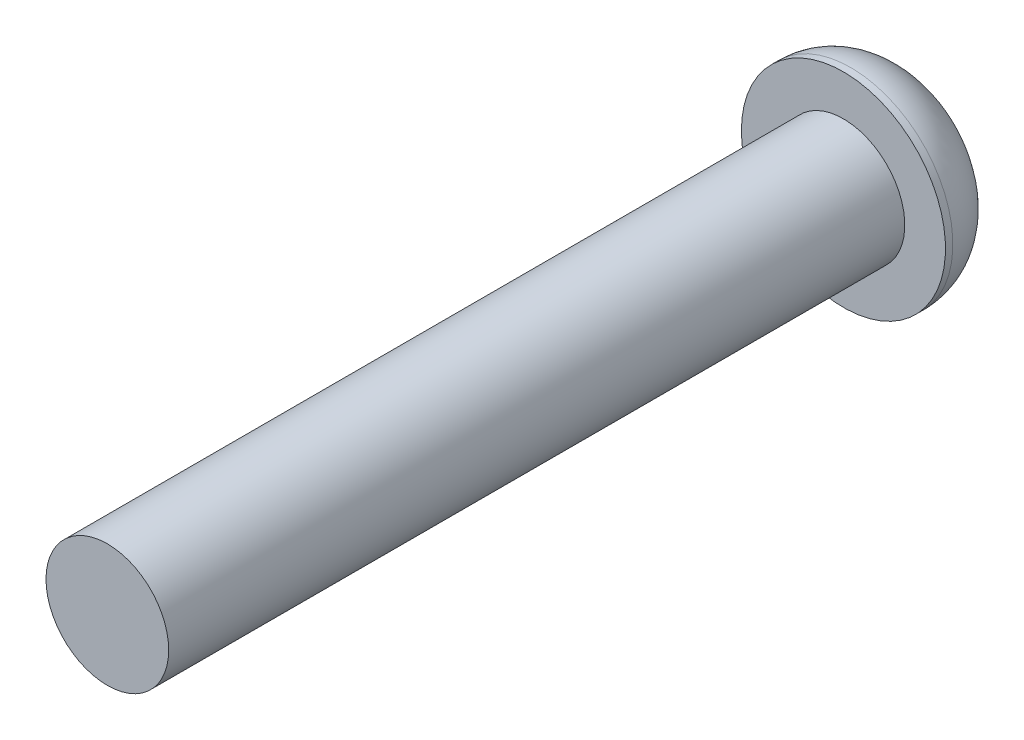
ISO-10303-21;
HEADER;
FILE_DESCRIPTION(('STEP AP214'),'2;1');
FILE_NAME('part.step','',(''),(''),'','','');
FILE_SCHEMA(('AUTOMOTIVE_DESIGN { 1 0 10303 214 1 1 1 1 }'));
ENDSEC;
DATA;
#1=APPLICATION_CONTEXT('core data for automotive mechanical design processes');
#2=APPLICATION_PROTOCOL_DEFINITION('international standard','automotive_design',2000,#1);
#3=PRODUCT_CONTEXT('',#1,'mechanical');
#4=PRODUCT('Part','Part','',(#3));
#5=PRODUCT_RELATED_PRODUCT_CATEGORY('part','',(#4));
#6=PRODUCT_DEFINITION_FORMATION('','',#4);
#7=PRODUCT_DEFINITION_CONTEXT('part definition',#1,'design');
#8=PRODUCT_DEFINITION('design','',#6,#7);
#9=PRODUCT_DEFINITION_SHAPE('','',#8);
#10=(LENGTH_UNIT() NAMED_UNIT(*) SI_UNIT(.MILLI.,.METRE.));
#11=(NAMED_UNIT(*) PLANE_ANGLE_UNIT() SI_UNIT($,.RADIAN.));
#12=(NAMED_UNIT(*) SI_UNIT($,.STERADIAN.) SOLID_ANGLE_UNIT());
#13=UNCERTAINTY_MEASURE_WITH_UNIT(LENGTH_MEASURE(1.E-05),#10,'distance_accuracy_value','');
#14=(GEOMETRIC_REPRESENTATION_CONTEXT(3) GLOBAL_UNCERTAINTY_ASSIGNED_CONTEXT((#13)) GLOBAL_UNIT_ASSIGNED_CONTEXT((#10,
#11,#12)) REPRESENTATION_CONTEXT('',''));
#15=CARTESIAN_POINT('',(0.,0.,0.));
#16=DIRECTION('',(0.,0.,1.));
#17=DIRECTION('',(1.,0.,0.));
#18=AXIS2_PLACEMENT_3D('',#15,#16,#17);
#19=CARTESIAN_POINT('',(0.,0.,30.));
#20=DIRECTION('',(0.,0.,-1.));
#21=DIRECTION('',(-1.,0.,0.));
#22=AXIS2_PLACEMENT_3D('',#19,#20,#21);
#23=CYLINDRICAL_SURFACE('',#22,2.5);
#24=CARTESIAN_POINT('',(0.,0.,30.));
#25=DIRECTION('',(0.,0.,1.));
#26=DIRECTION('',(1.,0.,0.));
#27=AXIS2_PLACEMENT_3D('',#24,#25,#26);
#28=CIRCLE('',#27,2.5);
#29=CARTESIAN_POINT('',(2.5,0.,30.));
#30=VERTEX_POINT('',#29);
#31=EDGE_CURVE('E146',#30,#30,#28,.T.);
#32=ORIENTED_EDGE('',*,*,#31,.F.);
#33=EDGE_LOOP('',(#32));
#34=FACE_BOUND('',#33,.T.);
#35=CARTESIAN_POINT('',(0.,0.,0.));
#36=DIRECTION('',(0.,0.,-1.));
#37=DIRECTION('',(-1.,0.,0.));
#38=AXIS2_PLACEMENT_3D('',#35,#36,#37);
#39=CIRCLE('',#38,2.5);
#40=CARTESIAN_POINT('',(-2.5,0.,0.));
#41=VERTEX_POINT('',#40);
#42=EDGE_CURVE('E143',#41,#41,#39,.T.);
#43=ORIENTED_EDGE('',*,*,#42,.F.);
#44=EDGE_LOOP('',(#43));
#45=FACE_BOUND('',#44,.T.);
#46=ADVANCED_FACE('F33',(#34,#45),#23,.T.);
#47=CARTESIAN_POINT('',(0.,0.,30.));
#48=DIRECTION('',(0.,0.,1.));
#49=DIRECTION('',(1.,0.,0.));
#50=AXIS2_PLACEMENT_3D('',#47,#48,#49);
#51=PLANE('',#50);
#52=ORIENTED_EDGE('',*,*,#31,.T.);
#53=EDGE_LOOP('',(#52));
#54=FACE_BOUND('',#53,.T.);
#55=ADVANCED_FACE('F167',(#54),#51,.T.);
#56=CARTESIAN_POINT('',(0.,0.,0.));
#57=DIRECTION('',(0.,0.,-1.));
#58=DIRECTION('',(-1.,0.,0.));
#59=AXIS2_PLACEMENT_3D('',#56,#57,#58);
#60=PLANE('',#59);
#61=CARTESIAN_POINT('',(0.,0.,0.));
#62=DIRECTION('',(0.,0.,-1.));
#63=DIRECTION('',(-1.,0.,0.));
#64=AXIS2_PLACEMENT_3D('',#61,#62,#63);
#65=CIRCLE('',#64,4.15958487677486);
#66=CARTESIAN_POINT('',(-4.15958487677486,0.,0.));
#67=VERTEX_POINT('',#66);
#68=EDGE_CURVE('E135',#67,#67,#65,.T.);
#69=ORIENTED_EDGE('',*,*,#68,.F.);
#70=EDGE_LOOP('',(#69));
#71=FACE_BOUND('',#70,.T.);
#72=ORIENTED_EDGE('',*,*,#42,.T.);
#73=EDGE_LOOP('',(#72));
#74=FACE_BOUND('',#73,.T.);
#75=ADVANCED_FACE('F172',(#71,#74),#60,.F.);
#76=CARTESIAN_POINT('',(0.,0.,-2.8));
#77=DIRECTION('',(0.,0.,1.));
#78=DIRECTION('',(1.,0.,0.));
#79=AXIS2_PLACEMENT_3D('',#76,#77,#78);
#80=CYLINDRICAL_SURFACE('',#79,4.15958487677486);
#81=CARTESIAN_POINT('',(0.,0.,-0.3));
#82=DIRECTION('',(0.,0.,-1.));
#83=DIRECTION('',(-1.,0.,0.));
#84=AXIS2_PLACEMENT_3D('',#81,#82,#83);
#85=CIRCLE('',#84,4.15958487677486);
#86=CARTESIAN_POINT('',(-4.15958487677486,0.,-0.3));
#87=VERTEX_POINT('',#86);
#88=EDGE_CURVE('E11',#87,#87,#85,.F.);
#89=ORIENTED_EDGE('',*,*,#88,.T.);
#90=EDGE_LOOP('',(#89));
#91=FACE_BOUND('',#90,.T.);
#92=ORIENTED_EDGE('',*,*,#68,.T.);
#93=EDGE_LOOP('',(#92));
#94=FACE_BOUND('',#93,.T.);
#95=ADVANCED_FACE('F162',(#91,#94),#80,.T.);
#96=CARTESIAN_POINT('',(0.,0.,-2.8));
#97=DIRECTION('',(0.,0.,-1.));
#98=DIRECTION('',(-1.,0.,0.));
#99=AXIS2_PLACEMENT_3D('',#96,#97,#98);
#100=PLANE('',#99);
#101=DIRECTION('',(-0.814788791019046,0.579757902947188,0.));
#102=VECTOR('',#101,1.);
#103=CARTESIAN_POINT('',(-0.144973678126217,-1.52414450415627,-2.8));
#104=LINE('',#103,#102);
#105=CARTESIAN_POINT('',(-0.144973678126217,-1.52414450415627,-2.8));
#106=VERTEX_POINT('',#105);
#107=CARTESIAN_POINT('',(-1.39243469870088,-0.636521363940765,-2.8));
#108=VERTEX_POINT('',#107);
#109=EDGE_CURVE('E48',#106,#108,#104,.T.);
#110=ORIENTED_EDGE('',*,*,#109,.F.);
#111=DIRECTION('',(-0.909479467506581,-0.415748840267711,0.));
#112=VECTOR('',#111,1.);
#113=CARTESIAN_POINT('',(1.24746102057466,-0.887623140215509,-2.8));
#114=LINE('',#113,#112);
#115=CARTESIAN_POINT('',(1.24746102057466,-0.887623140215509,-2.8));
#116=VERTEX_POINT('',#115);
#117=EDGE_CURVE('E131',#116,#106,#114,.T.);
#118=ORIENTED_EDGE('',*,*,#117,.F.);
#119=DIRECTION('',(-0.0946906764875342,-0.995506743214898,0.));
#120=VECTOR('',#119,1.);
#121=CARTESIAN_POINT('',(1.39243469870088,0.636521363940765,-2.8));
#122=LINE('',#121,#120);
#123=CARTESIAN_POINT('',(1.39243469870088,0.636521363940765,-2.8));
#124=VERTEX_POINT('',#123);
#125=EDGE_CURVE('E129',#124,#116,#122,.T.);
#126=ORIENTED_EDGE('',*,*,#125,.F.);
#127=DIRECTION('',(0.814788791019046,-0.579757902947188,0.));
#128=VECTOR('',#127,1.);
#129=CARTESIAN_POINT('',(0.144973678126217,1.52414450415627,-2.8));
#130=LINE('',#129,#128);
#131=CARTESIAN_POINT('',(0.144973678126217,1.52414450415627,-2.8));
#132=VERTEX_POINT('',#131);
#133=EDGE_CURVE('E96',#132,#124,#130,.T.);
#134=ORIENTED_EDGE('',*,*,#133,.F.);
#135=DIRECTION('',(0.909479467506581,0.41574884026771,0.));
#136=VECTOR('',#135,1.);
#137=CARTESIAN_POINT('',(-1.24746102057466,0.88762314021551,-2.8));
#138=LINE('',#137,#136);
#139=CARTESIAN_POINT('',(-1.24746102057466,0.88762314021551,-2.8));
#140=VERTEX_POINT('',#139);
#141=EDGE_CURVE('E125',#140,#132,#138,.T.);
#142=ORIENTED_EDGE('',*,*,#141,.F.);
#143=DIRECTION('',(0.0946906764875343,0.995506743214898,0.));
#144=VECTOR('',#143,1.);
#145=CARTESIAN_POINT('',(-1.39243469870088,-0.636521363940765,-2.8));
#146=LINE('',#145,#144);
#147=EDGE_CURVE('E122',#108,#140,#146,.T.);
#148=ORIENTED_EDGE('',*,*,#147,.F.);
#149=EDGE_LOOP('',(#110,#118,#126,#134,#142,#148));
#150=FACE_BOUND('',#149,.T.);
#151=CARTESIAN_POINT('',(0.,0.,-2.8));
#152=DIRECTION('',(0.,0.,-1.));
#153=DIRECTION('',(-1.,0.,0.));
#154=AXIS2_PLACEMENT_3D('',#151,#152,#153);
#155=CIRCLE('',#154,1.65958487677486);
#156=CARTESIAN_POINT('',(-1.65958487677486,0.,-2.8));
#157=VERTEX_POINT('',#156);
#158=EDGE_CURVE('E41',#157,#157,#155,.T.);
#159=ORIENTED_EDGE('',*,*,#158,.T.);
#160=EDGE_LOOP('',(#159));
#161=FACE_BOUND('',#160,.T.);
#162=ADVANCED_FACE('F151',(#150,#161),#100,.T.);
#163=CARTESIAN_POINT('',(0.,0.,-0.3));
#164=DIRECTION('',(0.,0.,-1.));
#165=DIRECTION('',(-1.,0.,0.));
#166=AXIS2_PLACEMENT_3D('',#163,#164,#165);
#167=DEGENERATE_TOROIDAL_SURFACE('',#166,1.65958487677486,2.5,.T.);
#168=ORIENTED_EDGE('',*,*,#88,.F.);
#169=EDGE_LOOP('',(#168));
#170=FACE_BOUND('',#169,.T.);
#171=ORIENTED_EDGE('',*,*,#158,.F.);
#172=EDGE_LOOP('',(#171));
#173=FACE_BOUND('',#172,.T.);
#174=ADVANCED_FACE('F35',(#170,#173),#167,.T.);
#175=CARTESIAN_POINT('',(-0.144973678126217,-1.52414450415627,-0.8));
#176=DIRECTION('',(-0.579757902947188,-0.814788791019046,0.));
#177=DIRECTION('',(0.814788791019046,-0.579757902947188,0.));
#178=AXIS2_PLACEMENT_3D('',#175,#176,#177);
#179=PLANE('',#178);
#180=ORIENTED_EDGE('',*,*,#109,.T.);
#181=DIRECTION('',(0.,0.,-1.));
#182=VECTOR('',#181,1.);
#183=CARTESIAN_POINT('',(-1.39243469870088,-0.636521363940765,-0.8));
#184=LINE('',#183,#182);
#185=CARTESIAN_POINT('',(-1.39243469870088,-0.636521363940765,-0.8));
#186=VERTEX_POINT('',#185);
#187=EDGE_CURVE('E78',#186,#108,#184,.T.);
#188=ORIENTED_EDGE('',*,*,#187,.F.);
#189=DIRECTION('',(-0.814788791019046,0.579757902947188,0.));
#190=VECTOR('',#189,1.);
#191=CARTESIAN_POINT('',(-0.144973678126217,-1.52414450415627,-0.8));
#192=LINE('',#191,#190);
#193=CARTESIAN_POINT('',(-0.144973678126217,-1.52414450415627,-0.8));
#194=VERTEX_POINT('',#193);
#195=EDGE_CURVE('E133',#194,#186,#192,.T.);
#196=ORIENTED_EDGE('',*,*,#195,.F.);
#197=DIRECTION('',(0.,0.,-1.));
#198=VECTOR('',#197,1.);
#199=CARTESIAN_POINT('',(-0.144973678126217,-1.52414450415627,-0.8));
#200=LINE('',#199,#198);
#201=EDGE_CURVE('E56',#194,#106,#200,.T.);
#202=ORIENTED_EDGE('',*,*,#201,.T.);
#203=EDGE_LOOP('',(#180,#188,#196,#202));
#204=FACE_BOUND('',#203,.T.);
#205=ADVANCED_FACE('F154',(#204),#179,.F.);
#206=CARTESIAN_POINT('',(1.24746102057466,-0.887623140215509,-0.8));
#207=DIRECTION('',(0.415748840267711,-0.909479467506581,0.));
#208=DIRECTION('',(0.909479467506581,0.415748840267711,0.));
#209=AXIS2_PLACEMENT_3D('',#206,#207,#208);
#210=PLANE('',#209);
#211=ORIENTED_EDGE('',*,*,#117,.T.);
#212=ORIENTED_EDGE('',*,*,#201,.F.);
#213=DIRECTION('',(-0.909479467506581,-0.415748840267711,0.));
#214=VECTOR('',#213,1.);
#215=CARTESIAN_POINT('',(1.24746102057466,-0.887623140215509,-0.8));
#216=LINE('',#215,#214);
#217=CARTESIAN_POINT('',(1.24746102057466,-0.887623140215509,-0.8));
#218=VERTEX_POINT('',#217);
#219=EDGE_CURVE('E108',#218,#194,#216,.T.);
#220=ORIENTED_EDGE('',*,*,#219,.F.);
#221=DIRECTION('',(0.,0.,-1.));
#222=VECTOR('',#221,1.);
#223=CARTESIAN_POINT('',(1.24746102057466,-0.887623140215509,-0.8));
#224=LINE('',#223,#222);
#225=EDGE_CURVE('E100',#218,#116,#224,.T.);
#226=ORIENTED_EDGE('',*,*,#225,.T.);
#227=EDGE_LOOP('',(#211,#212,#220,#226));
#228=FACE_BOUND('',#227,.T.);
#229=ADVANCED_FACE('F160',(#228),#210,.F.);
#230=CARTESIAN_POINT('',(1.39243469870088,0.636521363940765,-0.8));
#231=DIRECTION('',(0.995506743214898,-0.0946906764875343,0.));
#232=DIRECTION('',(0.0946906764875343,0.995506743214898,0.));
#233=AXIS2_PLACEMENT_3D('',#230,#231,#232);
#234=PLANE('',#233);
#235=ORIENTED_EDGE('',*,*,#125,.T.);
#236=ORIENTED_EDGE('',*,*,#225,.F.);
#237=DIRECTION('',(-0.0946906764875342,-0.995506743214898,0.));
#238=VECTOR('',#237,1.);
#239=CARTESIAN_POINT('',(1.39243469870088,0.636521363940765,-0.8));
#240=LINE('',#239,#238);
#241=CARTESIAN_POINT('',(1.39243469870088,0.636521363940765,-0.8));
#242=VERTEX_POINT('',#241);
#243=EDGE_CURVE('E104',#242,#218,#240,.T.);
#244=ORIENTED_EDGE('',*,*,#243,.F.);
#245=DIRECTION('',(0.,0.,-1.));
#246=VECTOR('',#245,1.);
#247=CARTESIAN_POINT('',(1.39243469870088,0.636521363940765,-0.8));
#248=LINE('',#247,#246);
#249=EDGE_CURVE('E89',#242,#124,#248,.T.);
#250=ORIENTED_EDGE('',*,*,#249,.T.);
#251=EDGE_LOOP('',(#235,#236,#244,#250));
#252=FACE_BOUND('',#251,.T.);
#253=ADVANCED_FACE('F105',(#252),#234,.F.);
#254=CARTESIAN_POINT('',(0.144973678126217,1.52414450415627,-0.8));
#255=DIRECTION('',(0.579757902947188,0.814788791019046,0.));
#256=DIRECTION('',(-0.814788791019047,0.579757902947188,0.));
#257=AXIS2_PLACEMENT_3D('',#254,#255,#256);
#258=PLANE('',#257);
#259=ORIENTED_EDGE('',*,*,#133,.T.);
#260=ORIENTED_EDGE('',*,*,#249,.F.);
#261=DIRECTION('',(0.814788791019046,-0.579757902947188,0.));
#262=VECTOR('',#261,1.);
#263=CARTESIAN_POINT('',(0.144973678126217,1.52414450415627,-0.8));
#264=LINE('',#263,#262);
#265=CARTESIAN_POINT('',(0.144973678126217,1.52414450415627,-0.8));
#266=VERTEX_POINT('',#265);
#267=EDGE_CURVE('E93',#266,#242,#264,.T.);
#268=ORIENTED_EDGE('',*,*,#267,.F.);
#269=DIRECTION('',(0.,0.,-1.));
#270=VECTOR('',#269,1.);
#271=CARTESIAN_POINT('',(0.144973678126217,1.52414450415627,-0.8));
#272=LINE('',#271,#270);
#273=EDGE_CURVE('E101',#266,#132,#272,.T.);
#274=ORIENTED_EDGE('',*,*,#273,.T.);
#275=EDGE_LOOP('',(#259,#260,#268,#274));
#276=FACE_BOUND('',#275,.T.);
#277=ADVANCED_FACE('F91',(#276),#258,.F.);
#278=CARTESIAN_POINT('',(-1.24746102057466,0.88762314021551,-0.8));
#279=DIRECTION('',(-0.41574884026771,0.909479467506581,0.));
#280=DIRECTION('',(-0.909479467506581,-0.41574884026771,0.));
#281=AXIS2_PLACEMENT_3D('',#278,#279,#280);
#282=PLANE('',#281);
#283=ORIENTED_EDGE('',*,*,#141,.T.);
#284=ORIENTED_EDGE('',*,*,#273,.F.);
#285=DIRECTION('',(0.909479467506581,0.41574884026771,0.));
#286=VECTOR('',#285,1.);
#287=CARTESIAN_POINT('',(-1.24746102057466,0.88762314021551,-0.8));
#288=LINE('',#287,#286);
#289=CARTESIAN_POINT('',(-1.24746102057466,0.88762314021551,-0.8));
#290=VERTEX_POINT('',#289);
#291=EDGE_CURVE('E114',#290,#266,#288,.T.);
#292=ORIENTED_EDGE('',*,*,#291,.F.);
#293=DIRECTION('',(0.,0.,-1.));
#294=VECTOR('',#293,1.);
#295=CARTESIAN_POINT('',(-1.24746102057466,0.88762314021551,-0.8));
#296=LINE('',#295,#294);
#297=EDGE_CURVE('E138',#290,#140,#296,.T.);
#298=ORIENTED_EDGE('',*,*,#297,.T.);
#299=EDGE_LOOP('',(#283,#284,#292,#298));
#300=FACE_BOUND('',#299,.T.);
#301=ADVANCED_FACE('F187',(#300),#282,.F.);
#302=CARTESIAN_POINT('',(-1.39243469870088,-0.636521363940765,-0.8));
#303=DIRECTION('',(-0.995506743214898,0.0946906764875343,0.));
#304=DIRECTION('',(-0.0946906764875343,-0.995506743214898,0.));
#305=AXIS2_PLACEMENT_3D('',#302,#303,#304);
#306=PLANE('',#305);
#307=ORIENTED_EDGE('',*,*,#147,.T.);
#308=ORIENTED_EDGE('',*,*,#297,.F.);
#309=DIRECTION('',(0.0946906764875343,0.995506743214898,0.));
#310=VECTOR('',#309,1.);
#311=CARTESIAN_POINT('',(-1.39243469870088,-0.636521363940765,-0.8));
#312=LINE('',#311,#310);
#313=EDGE_CURVE('E116',#186,#290,#312,.T.);
#314=ORIENTED_EDGE('',*,*,#313,.F.);
#315=ORIENTED_EDGE('',*,*,#187,.T.);
#316=EDGE_LOOP('',(#307,#308,#314,#315));
#317=FACE_BOUND('',#316,.T.);
#318=ADVANCED_FACE('F184',(#317),#306,.F.);
#319=CARTESIAN_POINT('',(0.,0.,-0.8));
#320=DIRECTION('',(0.,0.,-1.));
#321=DIRECTION('',(-1.,0.,0.));
#322=AXIS2_PLACEMENT_3D('',#319,#320,#321);
#323=PLANE('',#322);
#324=ORIENTED_EDGE('',*,*,#195,.T.);
#325=ORIENTED_EDGE('',*,*,#313,.T.);
#326=ORIENTED_EDGE('',*,*,#291,.T.);
#327=ORIENTED_EDGE('',*,*,#267,.T.);
#328=ORIENTED_EDGE('',*,*,#243,.T.);
#329=ORIENTED_EDGE('',*,*,#219,.T.);
#330=EDGE_LOOP('',(#324,#325,#326,#327,#328,#329));
#331=FACE_BOUND('',#330,.T.);
#332=ADVANCED_FACE('F111',(#331),#323,.T.);
#333=CLOSED_SHELL('',(#46,#55,#75,#95,#162,#174,#205,#229,#253,#277,#301,#318,#332));
#334=MANIFOLD_SOLID_BREP('B2',#333);
#335=ADVANCED_BREP_SHAPE_REPRESENTATION('',(#18,#334),#14);
#336=SHAPE_DEFINITION_REPRESENTATION(#9,#335);
ENDSEC;
END-ISO-10303-21;
